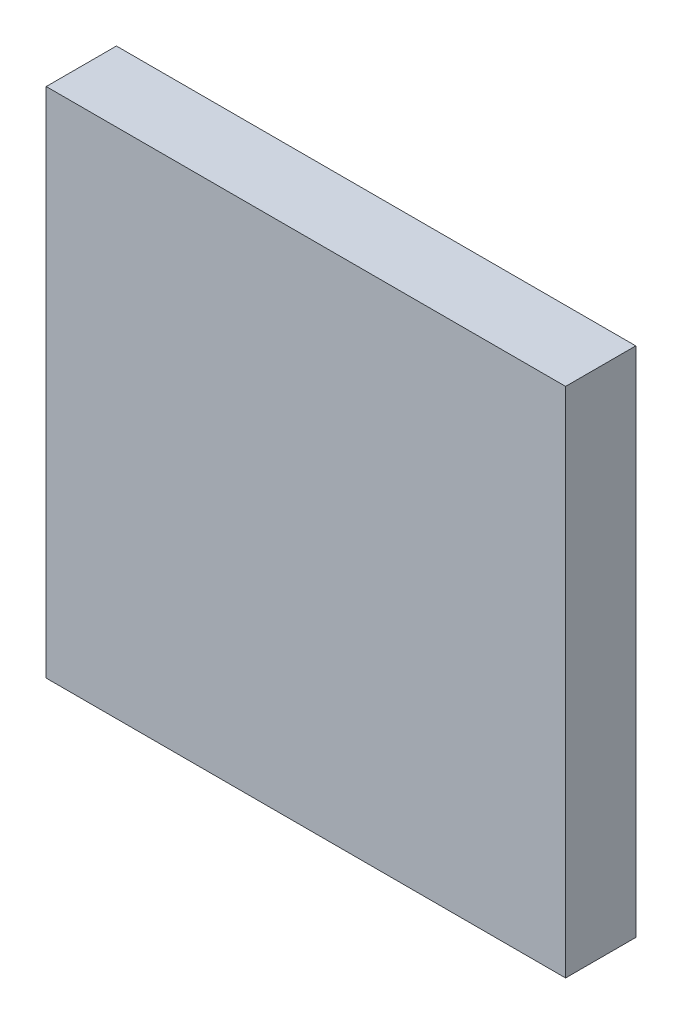
ISO-10303-21;
HEADER;
FILE_DESCRIPTION(('STEP AP214'),'2;1');
FILE_NAME('part.step','',(''),(''),'','','');
FILE_SCHEMA(('AUTOMOTIVE_DESIGN { 1 0 10303 214 1 1 1 1 }'));
ENDSEC;
DATA;
#1=APPLICATION_CONTEXT('core data for automotive mechanical design processes');
#2=APPLICATION_PROTOCOL_DEFINITION('international standard','automotive_design',2000,#1);
#3=PRODUCT_CONTEXT('',#1,'mechanical');
#4=PRODUCT('Part','Part','',(#3));
#5=PRODUCT_RELATED_PRODUCT_CATEGORY('part','',(#4));
#6=PRODUCT_DEFINITION_FORMATION('','',#4);
#7=PRODUCT_DEFINITION_CONTEXT('part definition',#1,'design');
#8=PRODUCT_DEFINITION('design','',#6,#7);
#9=PRODUCT_DEFINITION_SHAPE('','',#8);
#10=(LENGTH_UNIT() NAMED_UNIT(*) SI_UNIT(.MILLI.,.METRE.));
#11=(NAMED_UNIT(*) PLANE_ANGLE_UNIT() SI_UNIT($,.RADIAN.));
#12=(NAMED_UNIT(*) SI_UNIT($,.STERADIAN.) SOLID_ANGLE_UNIT());
#13=UNCERTAINTY_MEASURE_WITH_UNIT(LENGTH_MEASURE(1.E-05),#10,'distance_accuracy_value','');
#14=(GEOMETRIC_REPRESENTATION_CONTEXT(3) GLOBAL_UNCERTAINTY_ASSIGNED_CONTEXT((#13)) GLOBAL_UNIT_ASSIGNED_CONTEXT((#10,
#11,#12)) REPRESENTATION_CONTEXT('',''));
#15=CARTESIAN_POINT('',(0.,0.,0.));
#16=DIRECTION('',(0.,0.,1.));
#17=DIRECTION('',(1.,0.,0.));
#18=AXIS2_PLACEMENT_3D('',#15,#16,#17);
#19=CARTESIAN_POINT('',(3.7,3.65,1.));
#20=DIRECTION('',(0.,-1.,0.));
#21=DIRECTION('',(0.,0.,-1.));
#22=AXIS2_PLACEMENT_3D('',#19,#20,#21);
#23=PLANE('',#22);
#24=DIRECTION('',(-1.,0.,0.));
#25=VECTOR('',#24,1.);
#26=CARTESIAN_POINT('',(3.7,3.65,0.));
#27=LINE('',#26,#25);
#28=CARTESIAN_POINT('',(3.7,3.65,0.));
#29=VERTEX_POINT('',#28);
#30=CARTESIAN_POINT('',(-3.7,3.65,0.));
#31=VERTEX_POINT('',#30);
#32=EDGE_CURVE('E97',#29,#31,#27,.T.);
#33=ORIENTED_EDGE('',*,*,#32,.T.);
#34=DIRECTION('',(0.,0.,-1.));
#35=VECTOR('',#34,1.);
#36=CARTESIAN_POINT('',(-3.7,3.65,1.));
#37=LINE('',#36,#35);
#38=CARTESIAN_POINT('',(-3.7,3.65,1.));
#39=VERTEX_POINT('',#38);
#40=EDGE_CURVE('E11',#39,#31,#37,.T.);
#41=ORIENTED_EDGE('',*,*,#40,.F.);
#42=DIRECTION('',(-1.,0.,0.));
#43=VECTOR('',#42,1.);
#44=CARTESIAN_POINT('',(3.7,3.65,1.));
#45=LINE('',#44,#43);
#46=CARTESIAN_POINT('',(3.7,3.65,1.));
#47=VERTEX_POINT('',#46);
#48=EDGE_CURVE('E85',#47,#39,#45,.T.);
#49=ORIENTED_EDGE('',*,*,#48,.F.);
#50=DIRECTION('',(0.,0.,-1.));
#51=VECTOR('',#50,1.);
#52=CARTESIAN_POINT('',(3.7,3.65,1.));
#53=LINE('',#52,#51);
#54=EDGE_CURVE('E93',#47,#29,#53,.T.);
#55=ORIENTED_EDGE('',*,*,#54,.T.);
#56=EDGE_LOOP('',(#33,#41,#49,#55));
#57=FACE_BOUND('',#56,.T.);
#58=ADVANCED_FACE('F34',(#57),#23,.F.);
#59=CARTESIAN_POINT('',(-3.7,3.65,1.));
#60=DIRECTION('',(1.,0.,0.));
#61=DIRECTION('',(0.,0.,-1.));
#62=AXIS2_PLACEMENT_3D('',#59,#60,#61);
#63=PLANE('',#62);
#64=DIRECTION('',(0.,-1.,0.));
#65=VECTOR('',#64,1.);
#66=CARTESIAN_POINT('',(-3.7,3.65,0.));
#67=LINE('',#66,#65);
#68=CARTESIAN_POINT('',(-3.7,-3.65,0.));
#69=VERTEX_POINT('',#68);
#70=EDGE_CURVE('E89',#31,#69,#67,.T.);
#71=ORIENTED_EDGE('',*,*,#70,.T.);
#72=DIRECTION('',(0.,0.,-1.));
#73=VECTOR('',#72,1.);
#74=CARTESIAN_POINT('',(-3.7,-3.65,1.));
#75=LINE('',#74,#73);
#76=CARTESIAN_POINT('',(-3.7,-3.65,1.));
#77=VERTEX_POINT('',#76);
#78=EDGE_CURVE('E42',#77,#69,#75,.T.);
#79=ORIENTED_EDGE('',*,*,#78,.F.);
#80=DIRECTION('',(0.,-1.,0.));
#81=VECTOR('',#80,1.);
#82=CARTESIAN_POINT('',(-3.7,3.65,1.));
#83=LINE('',#82,#81);
#84=EDGE_CURVE('E80',#39,#77,#83,.T.);
#85=ORIENTED_EDGE('',*,*,#84,.F.);
#86=ORIENTED_EDGE('',*,*,#40,.T.);
#87=EDGE_LOOP('',(#71,#79,#85,#86));
#88=FACE_BOUND('',#87,.T.);
#89=ADVANCED_FACE('F88',(#88),#63,.F.);
#90=CARTESIAN_POINT('',(-3.7,-3.65,1.));
#91=DIRECTION('',(0.,1.,0.));
#92=DIRECTION('',(0.,0.,1.));
#93=AXIS2_PLACEMENT_3D('',#90,#91,#92);
#94=PLANE('',#93);
#95=DIRECTION('',(1.,0.,0.));
#96=VECTOR('',#95,1.);
#97=CARTESIAN_POINT('',(-3.7,-3.65,0.));
#98=LINE('',#97,#96);
#99=CARTESIAN_POINT('',(3.7,-3.65,0.));
#100=VERTEX_POINT('',#99);
#101=EDGE_CURVE('E67',#69,#100,#98,.T.);
#102=ORIENTED_EDGE('',*,*,#101,.T.);
#103=DIRECTION('',(0.,0.,-1.));
#104=VECTOR('',#103,1.);
#105=CARTESIAN_POINT('',(3.7,-3.65,1.));
#106=LINE('',#105,#104);
#107=CARTESIAN_POINT('',(3.7,-3.65,1.));
#108=VERTEX_POINT('',#107);
#109=EDGE_CURVE('E90',#108,#100,#106,.T.);
#110=ORIENTED_EDGE('',*,*,#109,.F.);
#111=DIRECTION('',(1.,0.,0.));
#112=VECTOR('',#111,1.);
#113=CARTESIAN_POINT('',(-3.7,-3.65,1.));
#114=LINE('',#113,#112);
#115=EDGE_CURVE('E83',#77,#108,#114,.T.);
#116=ORIENTED_EDGE('',*,*,#115,.F.);
#117=ORIENTED_EDGE('',*,*,#78,.T.);
#118=EDGE_LOOP('',(#102,#110,#116,#117));
#119=FACE_BOUND('',#118,.T.);
#120=ADVANCED_FACE('F91',(#119),#94,.F.);
#121=CARTESIAN_POINT('',(3.7,-3.65,1.));
#122=DIRECTION('',(-1.,0.,0.));
#123=DIRECTION('',(0.,0.,1.));
#124=AXIS2_PLACEMENT_3D('',#121,#122,#123);
#125=PLANE('',#124);
#126=DIRECTION('',(0.,1.,0.));
#127=VECTOR('',#126,1.);
#128=CARTESIAN_POINT('',(3.7,-3.65,0.));
#129=LINE('',#128,#127);
#130=EDGE_CURVE('E73',#100,#29,#129,.T.);
#131=ORIENTED_EDGE('',*,*,#130,.T.);
#132=ORIENTED_EDGE('',*,*,#54,.F.);
#133=DIRECTION('',(0.,1.,0.));
#134=VECTOR('',#133,1.);
#135=CARTESIAN_POINT('',(3.7,-3.65,1.));
#136=LINE('',#135,#134);
#137=EDGE_CURVE('E50',#108,#47,#136,.T.);
#138=ORIENTED_EDGE('',*,*,#137,.F.);
#139=ORIENTED_EDGE('',*,*,#109,.T.);
#140=EDGE_LOOP('',(#131,#132,#138,#139));
#141=FACE_BOUND('',#140,.T.);
#142=ADVANCED_FACE('F104',(#141),#125,.F.);
#143=CARTESIAN_POINT('',(0.,0.,1.));
#144=DIRECTION('',(0.,0.,1.));
#145=DIRECTION('',(1.,0.,0.));
#146=AXIS2_PLACEMENT_3D('',#143,#144,#145);
#147=PLANE('',#146);
#148=ORIENTED_EDGE('',*,*,#48,.T.);
#149=ORIENTED_EDGE('',*,*,#84,.T.);
#150=ORIENTED_EDGE('',*,*,#115,.T.);
#151=ORIENTED_EDGE('',*,*,#137,.T.);
#152=EDGE_LOOP('',(#148,#149,#150,#151));
#153=FACE_BOUND('',#152,.T.);
#154=ADVANCED_FACE('F81',(#153),#147,.T.);
#155=CARTESIAN_POINT('',(0.,0.,0.));
#156=DIRECTION('',(0.,0.,1.));
#157=DIRECTION('',(1.,0.,0.));
#158=AXIS2_PLACEMENT_3D('',#155,#156,#157);
#159=PLANE('',#158);
#160=ORIENTED_EDGE('',*,*,#32,.F.);
#161=ORIENTED_EDGE('',*,*,#130,.F.);
#162=ORIENTED_EDGE('',*,*,#101,.F.);
#163=ORIENTED_EDGE('',*,*,#70,.F.);
#164=EDGE_LOOP('',(#160,#161,#162,#163));
#165=FACE_BOUND('',#164,.T.);
#166=ADVANCED_FACE('F107',(#165),#159,.F.);
#167=CLOSED_SHELL('',(#58,#89,#120,#142,#154,#166));
#168=MANIFOLD_SOLID_BREP('B2',#167);
#169=ADVANCED_BREP_SHAPE_REPRESENTATION('',(#18,#168),#14);
#170=SHAPE_DEFINITION_REPRESENTATION(#9,#169);
ENDSEC;
END-ISO-10303-21;
